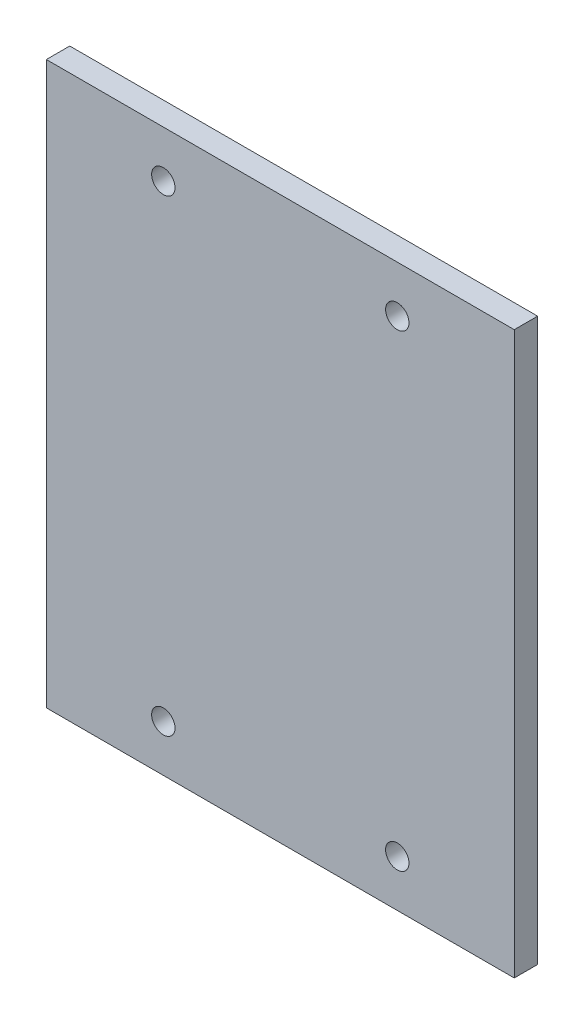
ISO-10303-21;
HEADER;
FILE_DESCRIPTION(('STEP AP214'),'2;1');
FILE_NAME('part.step','',(''),(''),'','','');
FILE_SCHEMA(('AUTOMOTIVE_DESIGN { 1 0 10303 214 1 1 1 1 }'));
ENDSEC;
DATA;
#1=APPLICATION_CONTEXT('core data for automotive mechanical design processes');
#2=APPLICATION_PROTOCOL_DEFINITION('international standard','automotive_design',2000,#1);
#3=PRODUCT_CONTEXT('',#1,'mechanical');
#4=PRODUCT('Part','Part','',(#3));
#5=PRODUCT_RELATED_PRODUCT_CATEGORY('part','',(#4));
#6=PRODUCT_DEFINITION_FORMATION('','',#4);
#7=PRODUCT_DEFINITION_CONTEXT('part definition',#1,'design');
#8=PRODUCT_DEFINITION('design','',#6,#7);
#9=PRODUCT_DEFINITION_SHAPE('','',#8);
#10=(LENGTH_UNIT() NAMED_UNIT(*) SI_UNIT(.MILLI.,.METRE.));
#11=(NAMED_UNIT(*) PLANE_ANGLE_UNIT() SI_UNIT($,.RADIAN.));
#12=(NAMED_UNIT(*) SI_UNIT($,.STERADIAN.) SOLID_ANGLE_UNIT());
#13=UNCERTAINTY_MEASURE_WITH_UNIT(LENGTH_MEASURE(1.E-05),#10,'distance_accuracy_value','');
#14=(GEOMETRIC_REPRESENTATION_CONTEXT(3) GLOBAL_UNCERTAINTY_ASSIGNED_CONTEXT((#13)) GLOBAL_UNIT_ASSIGNED_CONTEXT((#10,
#11,#12)) REPRESENTATION_CONTEXT('',''));
#15=CARTESIAN_POINT('',(0.,0.,0.));
#16=DIRECTION('',(0.,0.,1.));
#17=DIRECTION('',(1.,0.,0.));
#18=AXIS2_PLACEMENT_3D('',#15,#16,#17);
#19=CARTESIAN_POINT('',(0.,0.,6.35));
#20=DIRECTION('',(0.,0.,-1.));
#21=DIRECTION('',(-1.,0.,0.));
#22=AXIS2_PLACEMENT_3D('',#19,#20,#21);
#23=PLANE('',#22);
#24=DIRECTION('',(0.,1.,0.));
#25=VECTOR('',#24,1.);
#26=CARTESIAN_POINT('',(63.5,-76.2,6.35));
#27=LINE('',#26,#25);
#28=CARTESIAN_POINT('',(63.5,-76.2,6.35));
#29=VERTEX_POINT('',#28);
#30=CARTESIAN_POINT('',(63.5,76.2,6.35));
#31=VERTEX_POINT('',#30);
#32=EDGE_CURVE('E87',#29,#31,#27,.T.);
#33=ORIENTED_EDGE('',*,*,#32,.T.);
#34=DIRECTION('',(-1.,0.,0.));
#35=VECTOR('',#34,1.);
#36=CARTESIAN_POINT('',(-63.5,76.2,6.35));
#37=LINE('',#36,#35);
#38=CARTESIAN_POINT('',(-63.5,76.2,6.35));
#39=VERTEX_POINT('',#38);
#40=EDGE_CURVE('E82',#31,#39,#37,.T.);
#41=ORIENTED_EDGE('',*,*,#40,.T.);
#42=DIRECTION('',(0.,-1.,0.));
#43=VECTOR('',#42,1.);
#44=CARTESIAN_POINT('',(-63.5,-76.2,6.35));
#45=LINE('',#44,#43);
#46=CARTESIAN_POINT('',(-63.5,-76.2,6.35));
#47=VERTEX_POINT('',#46);
#48=EDGE_CURVE('E85',#39,#47,#45,.T.);
#49=ORIENTED_EDGE('',*,*,#48,.T.);
#50=DIRECTION('',(1.,0.,0.));
#51=VECTOR('',#50,1.);
#52=CARTESIAN_POINT('',(-63.5,-76.2,6.35));
#53=LINE('',#52,#51);
#54=EDGE_CURVE('E52',#47,#29,#53,.T.);
#55=ORIENTED_EDGE('',*,*,#54,.T.);
#56=EDGE_LOOP('',(#33,#41,#49,#55));
#57=FACE_BOUND('',#56,.T.);
#58=CARTESIAN_POINT('',(-31.75,-63.5,6.35));
#59=DIRECTION('',(0.,0.,1.));
#60=DIRECTION('',(1.,0.,0.));
#61=AXIS2_PLACEMENT_3D('',#58,#59,#60);
#62=CIRCLE('',#61,3.17499999999996);
#63=CARTESIAN_POINT('',(-28.575,-63.5,6.35));
#64=VERTEX_POINT('',#63);
#65=EDGE_CURVE('E102',#64,#64,#62,.T.);
#66=ORIENTED_EDGE('',*,*,#65,.F.);
#67=EDGE_LOOP('',(#66));
#68=FACE_BOUND('',#67,.T.);
#69=CARTESIAN_POINT('',(31.75,-63.5,6.35));
#70=DIRECTION('',(0.,0.,1.));
#71=DIRECTION('',(1.,0.,0.));
#72=AXIS2_PLACEMENT_3D('',#69,#70,#71);
#73=CIRCLE('',#72,3.17499999999996);
#74=CARTESIAN_POINT('',(34.925,-63.5,6.35));
#75=VERTEX_POINT('',#74);
#76=EDGE_CURVE('E117',#75,#75,#73,.T.);
#77=ORIENTED_EDGE('',*,*,#76,.F.);
#78=EDGE_LOOP('',(#77));
#79=FACE_BOUND('',#78,.T.);
#80=CARTESIAN_POINT('',(31.75,63.5,6.35));
#81=DIRECTION('',(0.,0.,1.));
#82=DIRECTION('',(1.,0.,0.));
#83=AXIS2_PLACEMENT_3D('',#80,#81,#82);
#84=CIRCLE('',#83,3.175);
#85=CARTESIAN_POINT('',(34.925,63.5,6.35));
#86=VERTEX_POINT('',#85);
#87=EDGE_CURVE('E123',#86,#86,#84,.T.);
#88=ORIENTED_EDGE('',*,*,#87,.F.);
#89=EDGE_LOOP('',(#88));
#90=FACE_BOUND('',#89,.T.);
#91=CARTESIAN_POINT('',(-31.75,63.5,6.35));
#92=DIRECTION('',(0.,0.,1.));
#93=DIRECTION('',(1.,0.,0.));
#94=AXIS2_PLACEMENT_3D('',#91,#92,#93);
#95=CIRCLE('',#94,3.175);
#96=CARTESIAN_POINT('',(-28.575,63.5,6.35));
#97=VERTEX_POINT('',#96);
#98=EDGE_CURVE('E129',#97,#97,#95,.T.);
#99=ORIENTED_EDGE('',*,*,#98,.F.);
#100=EDGE_LOOP('',(#99));
#101=FACE_BOUND('',#100,.T.);
#102=ADVANCED_FACE('F35',(#57,#68,#79,#90,#101),#23,.F.);
#103=CARTESIAN_POINT('',(0.,0.,0.));
#104=DIRECTION('',(0.,0.,-1.));
#105=DIRECTION('',(-1.,0.,0.));
#106=AXIS2_PLACEMENT_3D('',#103,#104,#105);
#107=PLANE('',#106);
#108=CARTESIAN_POINT('',(31.75,63.5,0.));
#109=DIRECTION('',(0.,0.,1.));
#110=DIRECTION('',(1.,0.,0.));
#111=AXIS2_PLACEMENT_3D('',#108,#109,#110);
#112=CIRCLE('',#111,3.175);
#113=CARTESIAN_POINT('',(34.925,63.5,0.));
#114=VERTEX_POINT('',#113);
#115=EDGE_CURVE('E126',#114,#114,#112,.T.);
#116=ORIENTED_EDGE('',*,*,#115,.T.);
#117=EDGE_LOOP('',(#116));
#118=FACE_BOUND('',#117,.T.);
#119=CARTESIAN_POINT('',(-31.75,-63.5,0.));
#120=DIRECTION('',(0.,0.,1.));
#121=DIRECTION('',(1.,0.,0.));
#122=AXIS2_PLACEMENT_3D('',#119,#120,#121);
#123=CIRCLE('',#122,3.17499999999996);
#124=CARTESIAN_POINT('',(-28.575,-63.5,0.));
#125=VERTEX_POINT('',#124);
#126=EDGE_CURVE('E114',#125,#125,#123,.T.);
#127=ORIENTED_EDGE('',*,*,#126,.T.);
#128=EDGE_LOOP('',(#127));
#129=FACE_BOUND('',#128,.T.);
#130=DIRECTION('',(0.,1.,0.));
#131=VECTOR('',#130,1.);
#132=CARTESIAN_POINT('',(63.5,-76.2,0.));
#133=LINE('',#132,#131);
#134=CARTESIAN_POINT('',(63.5,-76.2,0.));
#135=VERTEX_POINT('',#134);
#136=CARTESIAN_POINT('',(63.5,76.2,0.));
#137=VERTEX_POINT('',#136);
#138=EDGE_CURVE('E99',#135,#137,#133,.T.);
#139=ORIENTED_EDGE('',*,*,#138,.F.);
#140=DIRECTION('',(1.,0.,0.));
#141=VECTOR('',#140,1.);
#142=CARTESIAN_POINT('',(-63.5,-76.2,0.));
#143=LINE('',#142,#141);
#144=CARTESIAN_POINT('',(-63.5,-76.2,0.));
#145=VERTEX_POINT('',#144);
#146=EDGE_CURVE('E75',#145,#135,#143,.T.);
#147=ORIENTED_EDGE('',*,*,#146,.F.);
#148=DIRECTION('',(0.,-1.,0.));
#149=VECTOR('',#148,1.);
#150=CARTESIAN_POINT('',(-63.5,-76.2,0.));
#151=LINE('',#150,#149);
#152=CARTESIAN_POINT('',(-63.5,76.2,0.));
#153=VERTEX_POINT('',#152);
#154=EDGE_CURVE('E69',#153,#145,#151,.T.);
#155=ORIENTED_EDGE('',*,*,#154,.F.);
#156=DIRECTION('',(-1.,0.,0.));
#157=VECTOR('',#156,1.);
#158=CARTESIAN_POINT('',(-63.5,76.2,0.));
#159=LINE('',#158,#157);
#160=EDGE_CURVE('E91',#137,#153,#159,.T.);
#161=ORIENTED_EDGE('',*,*,#160,.F.);
#162=EDGE_LOOP('',(#139,#147,#155,#161));
#163=FACE_BOUND('',#162,.T.);
#164=CARTESIAN_POINT('',(31.75,-63.5,0.));
#165=DIRECTION('',(0.,0.,1.));
#166=DIRECTION('',(1.,0.,0.));
#167=AXIS2_PLACEMENT_3D('',#164,#165,#166);
#168=CIRCLE('',#167,3.17499999999996);
#169=CARTESIAN_POINT('',(34.925,-63.5,0.));
#170=VERTEX_POINT('',#169);
#171=EDGE_CURVE('E120',#170,#170,#168,.T.);
#172=ORIENTED_EDGE('',*,*,#171,.T.);
#173=EDGE_LOOP('',(#172));
#174=FACE_BOUND('',#173,.T.);
#175=CARTESIAN_POINT('',(-31.75,63.5,0.));
#176=DIRECTION('',(0.,0.,1.));
#177=DIRECTION('',(1.,0.,0.));
#178=AXIS2_PLACEMENT_3D('',#175,#176,#177);
#179=CIRCLE('',#178,3.175);
#180=CARTESIAN_POINT('',(-28.575,63.5,0.));
#181=VERTEX_POINT('',#180);
#182=EDGE_CURVE('E132',#181,#181,#179,.T.);
#183=ORIENTED_EDGE('',*,*,#182,.T.);
#184=EDGE_LOOP('',(#183));
#185=FACE_BOUND('',#184,.T.);
#186=ADVANCED_FACE('F110',(#118,#129,#163,#174,#185),#107,.T.);
#187=CARTESIAN_POINT('',(63.5,-76.2,6.35));
#188=DIRECTION('',(-1.,0.,0.));
#189=DIRECTION('',(0.,0.,1.));
#190=AXIS2_PLACEMENT_3D('',#187,#188,#189);
#191=PLANE('',#190);
#192=ORIENTED_EDGE('',*,*,#138,.T.);
#193=DIRECTION('',(0.,0.,-1.));
#194=VECTOR('',#193,1.);
#195=CARTESIAN_POINT('',(63.5,76.2,6.35));
#196=LINE('',#195,#194);
#197=EDGE_CURVE('E11',#31,#137,#196,.T.);
#198=ORIENTED_EDGE('',*,*,#197,.F.);
#199=ORIENTED_EDGE('',*,*,#32,.F.);
#200=DIRECTION('',(0.,0.,-1.));
#201=VECTOR('',#200,1.);
#202=CARTESIAN_POINT('',(63.5,-76.2,6.35));
#203=LINE('',#202,#201);
#204=EDGE_CURVE('E95',#29,#135,#203,.T.);
#205=ORIENTED_EDGE('',*,*,#204,.T.);
#206=EDGE_LOOP('',(#192,#198,#199,#205));
#207=FACE_BOUND('',#206,.T.);
#208=ADVANCED_FACE('F37',(#207),#191,.F.);
#209=CARTESIAN_POINT('',(-63.5,76.2,6.35));
#210=DIRECTION('',(0.,-1.,0.));
#211=DIRECTION('',(0.,0.,-1.));
#212=AXIS2_PLACEMENT_3D('',#209,#210,#211);
#213=PLANE('',#212);
#214=ORIENTED_EDGE('',*,*,#160,.T.);
#215=DIRECTION('',(0.,0.,-1.));
#216=VECTOR('',#215,1.);
#217=CARTESIAN_POINT('',(-63.5,76.2,6.35));
#218=LINE('',#217,#216);
#219=EDGE_CURVE('E44',#39,#153,#218,.T.);
#220=ORIENTED_EDGE('',*,*,#219,.F.);
#221=ORIENTED_EDGE('',*,*,#40,.F.);
#222=ORIENTED_EDGE('',*,*,#197,.T.);
#223=EDGE_LOOP('',(#214,#220,#221,#222));
#224=FACE_BOUND('',#223,.T.);
#225=ADVANCED_FACE('F90',(#224),#213,.F.);
#226=CARTESIAN_POINT('',(-63.5,-76.2,6.35));
#227=DIRECTION('',(1.,0.,0.));
#228=DIRECTION('',(0.,0.,-1.));
#229=AXIS2_PLACEMENT_3D('',#226,#227,#228);
#230=PLANE('',#229);
#231=ORIENTED_EDGE('',*,*,#154,.T.);
#232=DIRECTION('',(0.,0.,-1.));
#233=VECTOR('',#232,1.);
#234=CARTESIAN_POINT('',(-63.5,-76.2,6.35));
#235=LINE('',#234,#233);
#236=EDGE_CURVE('E92',#47,#145,#235,.T.);
#237=ORIENTED_EDGE('',*,*,#236,.F.);
#238=ORIENTED_EDGE('',*,*,#48,.F.);
#239=ORIENTED_EDGE('',*,*,#219,.T.);
#240=EDGE_LOOP('',(#231,#237,#238,#239));
#241=FACE_BOUND('',#240,.T.);
#242=ADVANCED_FACE('F93',(#241),#230,.F.);
#243=CARTESIAN_POINT('',(-63.5,-76.2,6.35));
#244=DIRECTION('',(0.,1.,0.));
#245=DIRECTION('',(0.,0.,1.));
#246=AXIS2_PLACEMENT_3D('',#243,#244,#245);
#247=PLANE('',#246);
#248=ORIENTED_EDGE('',*,*,#146,.T.);
#249=ORIENTED_EDGE('',*,*,#204,.F.);
#250=ORIENTED_EDGE('',*,*,#54,.F.);
#251=ORIENTED_EDGE('',*,*,#236,.T.);
#252=EDGE_LOOP('',(#248,#249,#250,#251));
#253=FACE_BOUND('',#252,.T.);
#254=ADVANCED_FACE('F107',(#253),#247,.F.);
#255=CARTESIAN_POINT('',(-31.75,-63.5,6.35));
#256=DIRECTION('',(0.,0.,-1.));
#257=DIRECTION('',(-1.,0.,0.));
#258=AXIS2_PLACEMENT_3D('',#255,#256,#257);
#259=CYLINDRICAL_SURFACE('',#258,3.17499999999996);
#260=ORIENTED_EDGE('',*,*,#65,.T.);
#261=EDGE_LOOP('',(#260));
#262=FACE_BOUND('',#261,.T.);
#263=ORIENTED_EDGE('',*,*,#126,.F.);
#264=EDGE_LOOP('',(#263));
#265=FACE_BOUND('',#264,.T.);
#266=ADVANCED_FACE('F149',(#262,#265),#259,.F.);
#267=CARTESIAN_POINT('',(31.75,-63.5,6.35));
#268=DIRECTION('',(0.,0.,-1.));
#269=DIRECTION('',(-1.,0.,0.));
#270=AXIS2_PLACEMENT_3D('',#267,#268,#269);
#271=CYLINDRICAL_SURFACE('',#270,3.17499999999996);
#272=ORIENTED_EDGE('',*,*,#76,.T.);
#273=EDGE_LOOP('',(#272));
#274=FACE_BOUND('',#273,.T.);
#275=ORIENTED_EDGE('',*,*,#171,.F.);
#276=EDGE_LOOP('',(#275));
#277=FACE_BOUND('',#276,.T.);
#278=ADVANCED_FACE('F195',(#274,#277),#271,.F.);
#279=CARTESIAN_POINT('',(31.75,63.5,6.35));
#280=DIRECTION('',(0.,0.,-1.));
#281=DIRECTION('',(-1.,0.,0.));
#282=AXIS2_PLACEMENT_3D('',#279,#280,#281);
#283=CYLINDRICAL_SURFACE('',#282,3.175);
#284=ORIENTED_EDGE('',*,*,#87,.T.);
#285=EDGE_LOOP('',(#284));
#286=FACE_BOUND('',#285,.T.);
#287=ORIENTED_EDGE('',*,*,#115,.F.);
#288=EDGE_LOOP('',(#287));
#289=FACE_BOUND('',#288,.T.);
#290=ADVANCED_FACE('F203',(#286,#289),#283,.F.);
#291=CARTESIAN_POINT('',(-31.75,63.5,6.35));
#292=DIRECTION('',(0.,0.,-1.));
#293=DIRECTION('',(-1.,0.,0.));
#294=AXIS2_PLACEMENT_3D('',#291,#292,#293);
#295=CYLINDRICAL_SURFACE('',#294,3.175);
#296=ORIENTED_EDGE('',*,*,#98,.T.);
#297=EDGE_LOOP('',(#296));
#298=FACE_BOUND('',#297,.T.);
#299=ORIENTED_EDGE('',*,*,#182,.F.);
#300=EDGE_LOOP('',(#299));
#301=FACE_BOUND('',#300,.T.);
#302=ADVANCED_FACE('F138',(#298,#301),#295,.F.);
#303=CLOSED_SHELL('',(#102,#186,#208,#225,#242,#254,#266,#278,#290,#302));
#304=MANIFOLD_SOLID_BREP('B2',#303);
#305=ADVANCED_BREP_SHAPE_REPRESENTATION('',(#18,#304),#14);
#306=SHAPE_DEFINITION_REPRESENTATION(#9,#305);
ENDSEC;
END-ISO-10303-21;
